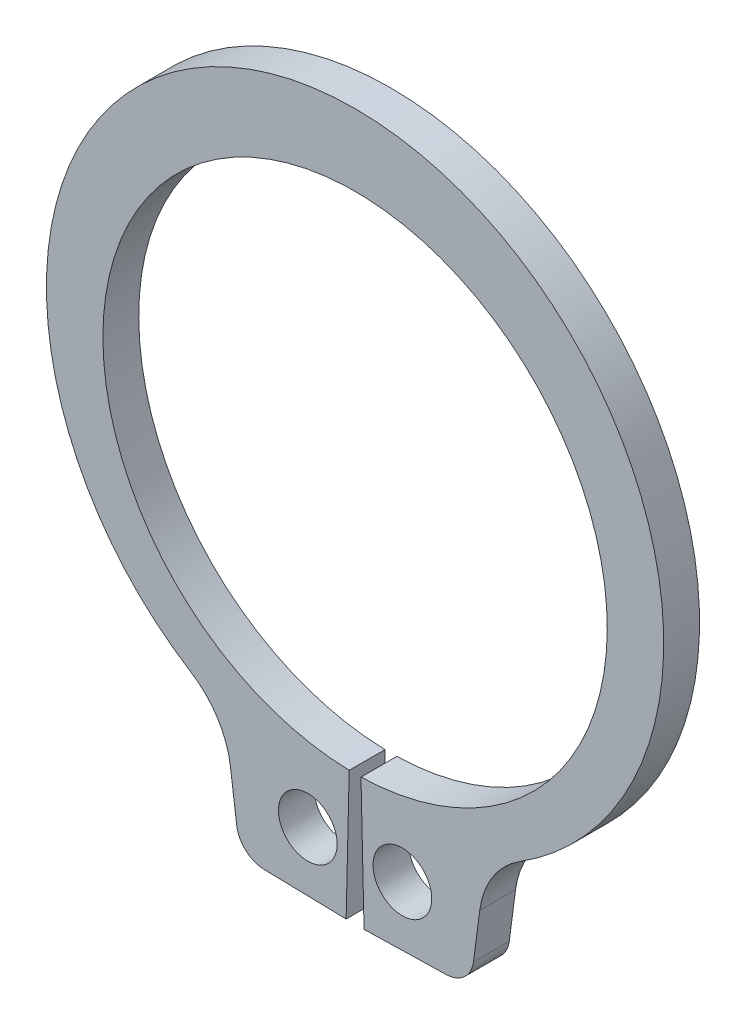
ISO-10303-21;
HEADER;
FILE_DESCRIPTION(('STEP AP214'),'2;1');
FILE_NAME('part.step','',(''),(''),'','','');
FILE_SCHEMA(('AUTOMOTIVE_DESIGN { 1 0 10303 214 1 1 1 1 }'));
ENDSEC;
DATA;
#1=APPLICATION_CONTEXT('core data for automotive mechanical design processes');
#2=APPLICATION_PROTOCOL_DEFINITION('international standard','automotive_design',2000,#1);
#3=PRODUCT_CONTEXT('',#1,'mechanical');
#4=PRODUCT('Part','Part','',(#3));
#5=PRODUCT_RELATED_PRODUCT_CATEGORY('part','',(#4));
#6=PRODUCT_DEFINITION_FORMATION('','',#4);
#7=PRODUCT_DEFINITION_CONTEXT('part definition',#1,'design');
#8=PRODUCT_DEFINITION('design','',#6,#7);
#9=PRODUCT_DEFINITION_SHAPE('','',#8);
#10=(LENGTH_UNIT() NAMED_UNIT(*) SI_UNIT(.MILLI.,.METRE.));
#11=(NAMED_UNIT(*) PLANE_ANGLE_UNIT() SI_UNIT($,.RADIAN.));
#12=(NAMED_UNIT(*) SI_UNIT($,.STERADIAN.) SOLID_ANGLE_UNIT());
#13=UNCERTAINTY_MEASURE_WITH_UNIT(LENGTH_MEASURE(1.E-05),#10,'distance_accuracy_value','');
#14=(GEOMETRIC_REPRESENTATION_CONTEXT(3) GLOBAL_UNCERTAINTY_ASSIGNED_CONTEXT((#13)) GLOBAL_UNIT_ASSIGNED_CONTEXT((#10,
#11,#12)) REPRESENTATION_CONTEXT('',''));
#15=CARTESIAN_POINT('',(0.,0.,0.));
#16=DIRECTION('',(0.,0.,1.));
#17=DIRECTION('',(1.,0.,0.));
#18=AXIS2_PLACEMENT_3D('',#15,#16,#17);
#19=CARTESIAN_POINT('',(0.,0.,-0.635));
#20=DIRECTION('',(0.,0.,1.));
#21=DIRECTION('',(1.,0.,0.));
#22=AXIS2_PLACEMENT_3D('',#19,#20,#21);
#23=CYLINDRICAL_SURFACE('',#22,4.4704);
#24=CARTESIAN_POINT('',(0.,0.,0.));
#25=DIRECTION('',(0.,0.,-1.));
#26=DIRECTION('',(1.,0.,0.));
#27=AXIS2_PLACEMENT_3D('',#24,#25,#26);
#28=CIRCLE('',#27,4.4704);
#29=CARTESIAN_POINT('',(-0.104644194756554,-4.46917506398035,0.));
#30=VERTEX_POINT('',#29);
#31=CARTESIAN_POINT('',(0.104644194756554,-4.46917506398035,0.));
#32=VERTEX_POINT('',#31);
#33=EDGE_CURVE('E162',#30,#32,#28,.T.);
#34=ORIENTED_EDGE('',*,*,#33,.F.);
#35=DIRECTION('',(0.,0.,1.));
#36=VECTOR('',#35,1.);
#37=CARTESIAN_POINT('',(-0.104644194756554,-4.46917506398035,-0.635));
#38=LINE('',#37,#36);
#39=CARTESIAN_POINT('',(-0.104644194756554,-4.46917506398035,-0.635));
#40=VERTEX_POINT('',#39);
#41=EDGE_CURVE('E11',#40,#30,#38,.T.);
#42=ORIENTED_EDGE('',*,*,#41,.F.);
#43=CARTESIAN_POINT('',(0.,0.,-0.635));
#44=DIRECTION('',(0.,0.,-1.));
#45=DIRECTION('',(1.,0.,0.));
#46=AXIS2_PLACEMENT_3D('',#43,#44,#45);
#47=CIRCLE('',#46,4.4704);
#48=CARTESIAN_POINT('',(0.104644194756554,-4.46917506398035,-0.635));
#49=VERTEX_POINT('',#48);
#50=EDGE_CURVE('E195',#40,#49,#47,.T.);
#51=ORIENTED_EDGE('',*,*,#50,.T.);
#52=DIRECTION('',(0.,0.,1.));
#53=VECTOR('',#52,1.);
#54=CARTESIAN_POINT('',(0.104644194756554,-4.46917506398035,-0.635));
#55=LINE('',#54,#53);
#56=EDGE_CURVE('E44',#49,#32,#55,.T.);
#57=ORIENTED_EDGE('',*,*,#56,.T.);
#58=EDGE_LOOP('',(#34,#42,#51,#57));
#59=FACE_BOUND('',#58,.T.);
#60=ADVANCED_FACE('F41',(#59),#23,.F.);
#61=CARTESIAN_POINT('',(-0.104644194756554,-4.46917506398035,-0.635));
#62=DIRECTION('',(0.99972598961622,-0.0234082397003745,0.));
#63=DIRECTION('',(0.0234082397003745,0.99972598961622,0.));
#64=AXIS2_PLACEMENT_3D('',#61,#62,#63);
#65=PLANE('',#64);
#66=DIRECTION('',(0.0234082397003745,0.99972598961622,0.));
#67=VECTOR('',#66,1.);
#68=CARTESIAN_POINT('',(-0.104644194756554,-4.46917506398035,0.));
#69=LINE('',#68,#67);
#70=CARTESIAN_POINT('',(-0.15875,-6.77994171637928,0.));
#71=VERTEX_POINT('',#70);
#72=EDGE_CURVE('E193',#71,#30,#69,.T.);
#73=ORIENTED_EDGE('',*,*,#72,.F.);
#74=DIRECTION('',(0.,0.,1.));
#75=VECTOR('',#74,1.);
#76=CARTESIAN_POINT('',(-0.15875,-6.77994171637928,-0.635));
#77=LINE('',#76,#75);
#78=CARTESIAN_POINT('',(-0.15875,-6.77994171637928,-0.635));
#79=VERTEX_POINT('',#78);
#80=EDGE_CURVE('E50',#79,#71,#77,.T.);
#81=ORIENTED_EDGE('',*,*,#80,.F.);
#82=DIRECTION('',(0.0234082397003745,0.99972598961622,0.));
#83=VECTOR('',#82,1.);
#84=CARTESIAN_POINT('',(-0.104644194756554,-4.46917506398035,-0.635));
#85=LINE('',#84,#83);
#86=EDGE_CURVE('E152',#79,#40,#85,.T.);
#87=ORIENTED_EDGE('',*,*,#86,.T.);
#88=ORIENTED_EDGE('',*,*,#41,.T.);
#89=EDGE_LOOP('',(#73,#81,#87,#88));
#90=FACE_BOUND('',#89,.T.);
#91=ADVANCED_FACE('F215',(#90),#65,.T.);
#92=CARTESIAN_POINT('',(-0.15875,-6.77994171637928,-0.635));
#93=DIRECTION('',(-0.0234082397003748,-0.99972598961622,0.));
#94=DIRECTION('',(0.99972598961622,-0.0234082397003748,0.));
#95=AXIS2_PLACEMENT_3D('',#92,#93,#94);
#96=PLANE('',#95);
#97=DIRECTION('',(0.99972598961622,-0.0234082397003748,0.));
#98=VECTOR('',#97,1.);
#99=CARTESIAN_POINT('',(-0.15875,-6.77994171637928,0.));
#100=LINE('',#99,#98);
#101=CARTESIAN_POINT('',(-1.61409910187213,-6.74586521844065,0.));
#102=VERTEX_POINT('',#101);
#103=EDGE_CURVE('E139',#102,#71,#100,.T.);
#104=ORIENTED_EDGE('',*,*,#103,.F.);
#105=DIRECTION('',(0.,0.,1.));
#106=VECTOR('',#105,1.);
#107=CARTESIAN_POINT('',(-1.61409910187213,-6.74586521844065,-0.635));
#108=LINE('',#107,#106);
#109=CARTESIAN_POINT('',(-1.61409910187213,-6.74586521844065,-0.635));
#110=VERTEX_POINT('',#109);
#111=EDGE_CURVE('E134',#110,#102,#108,.T.);
#112=ORIENTED_EDGE('',*,*,#111,.F.);
#113=DIRECTION('',(0.99972598961622,-0.0234082397003748,0.));
#114=VECTOR('',#113,1.);
#115=CARTESIAN_POINT('',(-0.15875,-6.77994171637928,-0.635));
#116=LINE('',#115,#114);
#117=EDGE_CURVE('E137',#110,#79,#116,.T.);
#118=ORIENTED_EDGE('',*,*,#117,.T.);
#119=ORIENTED_EDGE('',*,*,#80,.T.);
#120=EDGE_LOOP('',(#104,#112,#118,#119));
#121=FACE_BOUND('',#120,.T.);
#122=ADVANCED_FACE('F136',(#121),#96,.T.);
#123=CARTESIAN_POINT('',(-1.60239498202195,-6.24600222363254,-0.635));
#124=DIRECTION('',(0.,0.,1.));
#125=DIRECTION('',(1.,0.,0.));
#126=AXIS2_PLACEMENT_3D('',#123,#124,#125);
#127=CYLINDRICAL_SURFACE('',#126,0.5);
#128=CARTESIAN_POINT('',(-1.60239498202195,-6.24600222363254,0.));
#129=DIRECTION('',(0.,0.,1.));
#130=DIRECTION('',(1.,0.,0.));
#131=AXIS2_PLACEMENT_3D('',#128,#129,#130);
#132=CIRCLE('',#131,0.5);
#133=CARTESIAN_POINT('',(-2.09811741270885,-6.31126531974257,0.));
#134=VERTEX_POINT('',#133);
#135=EDGE_CURVE('E190',#134,#102,#132,.T.);
#136=ORIENTED_EDGE('',*,*,#135,.F.);
#137=DIRECTION('',(0.,0.,1.));
#138=VECTOR('',#137,1.);
#139=CARTESIAN_POINT('',(-2.09811741270885,-6.31126531974257,-0.635));
#140=LINE('',#139,#138);
#141=CARTESIAN_POINT('',(-2.09811741270885,-6.31126531974257,-0.635));
#142=VERTEX_POINT('',#141);
#143=EDGE_CURVE('E144',#142,#134,#140,.T.);
#144=ORIENTED_EDGE('',*,*,#143,.F.);
#145=CARTESIAN_POINT('',(-1.60239498202195,-6.24600222363254,-0.635));
#146=DIRECTION('',(0.,0.,1.));
#147=DIRECTION('',(1.,0.,0.));
#148=AXIS2_PLACEMENT_3D('',#145,#146,#147);
#149=CIRCLE('',#148,0.5);
#150=EDGE_CURVE('E150',#142,#110,#149,.T.);
#151=ORIENTED_EDGE('',*,*,#150,.T.);
#152=ORIENTED_EDGE('',*,*,#111,.T.);
#153=EDGE_LOOP('',(#136,#144,#151,#152));
#154=FACE_BOUND('',#153,.T.);
#155=ADVANCED_FACE('F154',(#154),#127,.T.);
#156=CARTESIAN_POINT('',(-2.21001393120872,-5.46132687914755,-0.635));
#157=DIRECTION('',(-0.991444861373811,-0.130526192220051,0.));
#158=DIRECTION('',(0.130526192220051,-0.991444861373811,0.));
#159=AXIS2_PLACEMENT_3D('',#156,#157,#158);
#160=PLANE('',#159);
#161=DIRECTION('',(0.130526192220051,-0.991444861373811,0.));
#162=VECTOR('',#161,1.);
#163=CARTESIAN_POINT('',(-2.21001393120872,-5.46132687914755,0.));
#164=LINE('',#163,#162);
#165=CARTESIAN_POINT('',(-2.21001393120872,-5.46132687914755,0.));
#166=VERTEX_POINT('',#165);
#167=EDGE_CURVE('E187',#166,#134,#164,.T.);
#168=ORIENTED_EDGE('',*,*,#167,.F.);
#169=DIRECTION('',(0.,0.,1.));
#170=VECTOR('',#169,1.);
#171=CARTESIAN_POINT('',(-2.21001393120872,-5.46132687914755,-0.635));
#172=LINE('',#171,#170);
#173=CARTESIAN_POINT('',(-2.21001393120872,-5.46132687914755,-0.635));
#174=VERTEX_POINT('',#173);
#175=EDGE_CURVE('E199',#174,#166,#172,.T.);
#176=ORIENTED_EDGE('',*,*,#175,.F.);
#177=DIRECTION('',(0.130526192220051,-0.991444861373811,0.));
#178=VECTOR('',#177,1.);
#179=CARTESIAN_POINT('',(-2.21001393120872,-5.46132687914755,-0.635));
#180=LINE('',#179,#178);
#181=EDGE_CURVE('E155',#174,#142,#180,.T.);
#182=ORIENTED_EDGE('',*,*,#181,.T.);
#183=ORIENTED_EDGE('',*,*,#143,.T.);
#184=EDGE_LOOP('',(#168,#176,#182,#183));
#185=FACE_BOUND('',#184,.T.);
#186=ADVANCED_FACE('F228',(#185),#160,.T.);
#187=CARTESIAN_POINT('',(-3.73313206779057,-5.66184918594921,-0.635));
#188=DIRECTION('',(0.,0.,1.));
#189=DIRECTION('',(1.,0.,0.));
#190=AXIS2_PLACEMENT_3D('',#187,#188,#189);
#191=CYLINDRICAL_SURFACE('',#190,1.53626106294132);
#192=CARTESIAN_POINT('',(-3.73313206779057,-5.66184918594921,0.));
#193=DIRECTION('',(0.,0.,-1.));
#194=DIRECTION('',(1.,0.,0.));
#195=AXIS2_PLACEMENT_3D('',#192,#193,#194);
#196=CIRCLE('',#195,1.53626106294132);
#197=CARTESIAN_POINT('',(-2.91475044430294,-4.36171474219066,0.));
#198=VERTEX_POINT('',#197);
#199=EDGE_CURVE('E184',#198,#166,#196,.T.);
#200=ORIENTED_EDGE('',*,*,#199,.F.);
#201=DIRECTION('',(0.,0.,1.));
#202=VECTOR('',#201,1.);
#203=CARTESIAN_POINT('',(-2.91475044430294,-4.36171474219066,-0.635));
#204=LINE('',#203,#202);
#205=CARTESIAN_POINT('',(-2.91475044430294,-4.36171474219066,-0.635));
#206=VERTEX_POINT('',#205);
#207=EDGE_CURVE('E201',#206,#198,#204,.T.);
#208=ORIENTED_EDGE('',*,*,#207,.F.);
#209=CARTESIAN_POINT('',(-3.73313206779057,-5.66184918594921,-0.635));
#210=DIRECTION('',(0.,0.,-1.));
#211=DIRECTION('',(1.,0.,0.));
#212=AXIS2_PLACEMENT_3D('',#209,#210,#211);
#213=CIRCLE('',#212,1.53626106294132);
#214=EDGE_CURVE('E157',#206,#174,#213,.T.);
#215=ORIENTED_EDGE('',*,*,#214,.T.);
#216=ORIENTED_EDGE('',*,*,#175,.T.);
#217=EDGE_LOOP('',(#200,#208,#215,#216));
#218=FACE_BOUND('',#217,.T.);
#219=ADVANCED_FACE('F231',(#218),#191,.F.);
#220=CARTESIAN_POINT('',(0.,0.268847991426328,-0.635));
#221=DIRECTION('',(0.,0.,1.));
#222=DIRECTION('',(1.,0.,0.));
#223=AXIS2_PLACEMENT_3D('',#220,#221,#222);
#224=CYLINDRICAL_SURFACE('',#223,5.47155200857367);
#225=CARTESIAN_POINT('',(0.,0.268847991426328,0.));
#226=DIRECTION('',(0.,0.,1.));
#227=DIRECTION('',(1.,0.,0.));
#228=AXIS2_PLACEMENT_3D('',#225,#226,#227);
#229=CIRCLE('',#228,5.47155200857367);
#230=CARTESIAN_POINT('',(2.91475044430293,-4.36171474219066,0.));
#231=VERTEX_POINT('',#230);
#232=EDGE_CURVE('E181',#231,#198,#229,.T.);
#233=ORIENTED_EDGE('',*,*,#232,.F.);
#234=DIRECTION('',(0.,0.,1.));
#235=VECTOR('',#234,1.);
#236=CARTESIAN_POINT('',(2.91475044430293,-4.36171474219066,-0.635));
#237=LINE('',#236,#235);
#238=CARTESIAN_POINT('',(2.91475044430293,-4.36171474219066,-0.635));
#239=VERTEX_POINT('',#238);
#240=EDGE_CURVE('E203',#239,#231,#237,.T.);
#241=ORIENTED_EDGE('',*,*,#240,.F.);
#242=CARTESIAN_POINT('',(0.,0.268847991426328,-0.635));
#243=DIRECTION('',(0.,0.,1.));
#244=DIRECTION('',(1.,0.,0.));
#245=AXIS2_PLACEMENT_3D('',#242,#243,#244);
#246=CIRCLE('',#245,5.47155200857367);
#247=EDGE_CURVE('E305',#239,#206,#246,.T.);
#248=ORIENTED_EDGE('',*,*,#247,.T.);
#249=ORIENTED_EDGE('',*,*,#207,.T.);
#250=EDGE_LOOP('',(#233,#241,#248,#249));
#251=FACE_BOUND('',#250,.T.);
#252=ADVANCED_FACE('F235',(#251),#224,.T.);
#253=CARTESIAN_POINT('',(3.73313206779057,-5.66184918594921,-0.635));
#254=DIRECTION('',(0.,0.,1.));
#255=DIRECTION('',(1.,0.,0.));
#256=AXIS2_PLACEMENT_3D('',#253,#254,#255);
#257=CYLINDRICAL_SURFACE('',#256,1.53626106294132);
#258=CARTESIAN_POINT('',(3.73313206779057,-5.66184918594921,0.));
#259=DIRECTION('',(0.,0.,-1.));
#260=DIRECTION('',(1.,0.,0.));
#261=AXIS2_PLACEMENT_3D('',#258,#259,#260);
#262=CIRCLE('',#261,1.53626106294132);
#263=CARTESIAN_POINT('',(2.21001393120872,-5.46132687914755,0.));
#264=VERTEX_POINT('',#263);
#265=EDGE_CURVE('E178',#264,#231,#262,.T.);
#266=ORIENTED_EDGE('',*,*,#265,.F.);
#267=DIRECTION('',(0.,0.,1.));
#268=VECTOR('',#267,1.);
#269=CARTESIAN_POINT('',(2.21001393120872,-5.46132687914755,-0.635));
#270=LINE('',#269,#268);
#271=CARTESIAN_POINT('',(2.21001393120872,-5.46132687914755,-0.635));
#272=VERTEX_POINT('',#271);
#273=EDGE_CURVE('E205',#272,#264,#270,.T.);
#274=ORIENTED_EDGE('',*,*,#273,.F.);
#275=CARTESIAN_POINT('',(3.73313206779057,-5.66184918594921,-0.635));
#276=DIRECTION('',(0.,0.,-1.));
#277=DIRECTION('',(1.,0.,0.));
#278=AXIS2_PLACEMENT_3D('',#275,#276,#277);
#279=CIRCLE('',#278,1.53626106294132);
#280=EDGE_CURVE('E302',#272,#239,#279,.T.);
#281=ORIENTED_EDGE('',*,*,#280,.T.);
#282=ORIENTED_EDGE('',*,*,#240,.T.);
#283=EDGE_LOOP('',(#266,#274,#281,#282));
#284=FACE_BOUND('',#283,.T.);
#285=ADVANCED_FACE('F239',(#284),#257,.F.);
#286=CARTESIAN_POINT('',(2.21001393120872,-5.46132687914755,-0.635));
#287=DIRECTION('',(0.991444861373811,-0.130526192220051,0.));
#288=DIRECTION('',(0.130526192220051,0.991444861373811,0.));
#289=AXIS2_PLACEMENT_3D('',#286,#287,#288);
#290=PLANE('',#289);
#291=DIRECTION('',(0.130526192220051,0.991444861373811,0.));
#292=VECTOR('',#291,1.);
#293=CARTESIAN_POINT('',(2.21001393120872,-5.46132687914755,0.));
#294=LINE('',#293,#292);
#295=CARTESIAN_POINT('',(2.09811741270885,-6.31126531974257,0.));
#296=VERTEX_POINT('',#295);
#297=EDGE_CURVE('E175',#296,#264,#294,.T.);
#298=ORIENTED_EDGE('',*,*,#297,.F.);
#299=DIRECTION('',(0.,0.,1.));
#300=VECTOR('',#299,1.);
#301=CARTESIAN_POINT('',(2.09811741270885,-6.31126531974257,-0.635));
#302=LINE('',#301,#300);
#303=CARTESIAN_POINT('',(2.09811741270885,-6.31126531974257,-0.635));
#304=VERTEX_POINT('',#303);
#305=EDGE_CURVE('E207',#304,#296,#302,.T.);
#306=ORIENTED_EDGE('',*,*,#305,.F.);
#307=DIRECTION('',(0.130526192220051,0.991444861373811,0.));
#308=VECTOR('',#307,1.);
#309=CARTESIAN_POINT('',(2.21001393120872,-5.46132687914755,-0.635));
#310=LINE('',#309,#308);
#311=EDGE_CURVE('E299',#304,#272,#310,.T.);
#312=ORIENTED_EDGE('',*,*,#311,.T.);
#313=ORIENTED_EDGE('',*,*,#273,.T.);
#314=EDGE_LOOP('',(#298,#306,#312,#313));
#315=FACE_BOUND('',#314,.T.);
#316=ADVANCED_FACE('F243',(#315),#290,.T.);
#317=CARTESIAN_POINT('',(1.60239498202195,-6.24600222363254,-0.635));
#318=DIRECTION('',(0.,0.,1.));
#319=DIRECTION('',(1.,0.,0.));
#320=AXIS2_PLACEMENT_3D('',#317,#318,#319);
#321=CYLINDRICAL_SURFACE('',#320,0.5);
#322=CARTESIAN_POINT('',(1.60239498202195,-6.24600222363254,0.));
#323=DIRECTION('',(0.,0.,1.));
#324=DIRECTION('',(-1.,0.,0.));
#325=AXIS2_PLACEMENT_3D('',#322,#323,#324);
#326=CIRCLE('',#325,0.5);
#327=CARTESIAN_POINT('',(1.61409910187213,-6.74586521844065,0.));
#328=VERTEX_POINT('',#327);
#329=EDGE_CURVE('E172',#328,#296,#326,.T.);
#330=ORIENTED_EDGE('',*,*,#329,.F.);
#331=DIRECTION('',(0.,0.,1.));
#332=VECTOR('',#331,1.);
#333=CARTESIAN_POINT('',(1.61409910187213,-6.74586521844065,-0.635));
#334=LINE('',#333,#332);
#335=CARTESIAN_POINT('',(1.61409910187213,-6.74586521844065,-0.635));
#336=VERTEX_POINT('',#335);
#337=EDGE_CURVE('E209',#336,#328,#334,.T.);
#338=ORIENTED_EDGE('',*,*,#337,.F.);
#339=CARTESIAN_POINT('',(1.60239498202195,-6.24600222363254,-0.635));
#340=DIRECTION('',(0.,0.,1.));
#341=DIRECTION('',(-1.,0.,0.));
#342=AXIS2_PLACEMENT_3D('',#339,#340,#341);
#343=CIRCLE('',#342,0.5);
#344=EDGE_CURVE('E296',#336,#304,#343,.T.);
#345=ORIENTED_EDGE('',*,*,#344,.T.);
#346=ORIENTED_EDGE('',*,*,#305,.T.);
#347=EDGE_LOOP('',(#330,#338,#345,#346));
#348=FACE_BOUND('',#347,.T.);
#349=ADVANCED_FACE('F247',(#348),#321,.T.);
#350=CARTESIAN_POINT('',(0.15875,-6.77994171637928,-0.635));
#351=DIRECTION('',(0.0234082397003748,-0.99972598961622,0.));
#352=DIRECTION('',(0.99972598961622,0.0234082397003748,0.));
#353=AXIS2_PLACEMENT_3D('',#350,#351,#352);
#354=PLANE('',#353);
#355=DIRECTION('',(0.99972598961622,0.0234082397003748,0.));
#356=VECTOR('',#355,1.);
#357=CARTESIAN_POINT('',(0.15875,-6.77994171637928,0.));
#358=LINE('',#357,#356);
#359=CARTESIAN_POINT('',(0.15875,-6.77994171637928,0.));
#360=VERTEX_POINT('',#359);
#361=EDGE_CURVE('E169',#360,#328,#358,.T.);
#362=ORIENTED_EDGE('',*,*,#361,.F.);
#363=DIRECTION('',(0.,0.,1.));
#364=VECTOR('',#363,1.);
#365=CARTESIAN_POINT('',(0.15875,-6.77994171637928,-0.635));
#366=LINE('',#365,#364);
#367=CARTESIAN_POINT('',(0.15875,-6.77994171637928,-0.635));
#368=VERTEX_POINT('',#367);
#369=EDGE_CURVE('E210',#368,#360,#366,.T.);
#370=ORIENTED_EDGE('',*,*,#369,.F.);
#371=DIRECTION('',(0.99972598961622,0.0234082397003748,0.));
#372=VECTOR('',#371,1.);
#373=CARTESIAN_POINT('',(0.15875,-6.77994171637928,-0.635));
#374=LINE('',#373,#372);
#375=EDGE_CURVE('E293',#368,#336,#374,.T.);
#376=ORIENTED_EDGE('',*,*,#375,.T.);
#377=ORIENTED_EDGE('',*,*,#337,.T.);
#378=EDGE_LOOP('',(#362,#370,#376,#377));
#379=FACE_BOUND('',#378,.T.);
#380=ADVANCED_FACE('F251',(#379),#354,.T.);
#381=CARTESIAN_POINT('',(0.104644194756554,-4.46917506398035,-0.635));
#382=DIRECTION('',(-0.99972598961622,-0.0234082397003745,0.));
#383=DIRECTION('',(0.0234082397003745,-0.99972598961622,0.));
#384=AXIS2_PLACEMENT_3D('',#381,#382,#383);
#385=PLANE('',#384);
#386=DIRECTION('',(0.0234082397003745,-0.99972598961622,0.));
#387=VECTOR('',#386,1.);
#388=CARTESIAN_POINT('',(0.104644194756554,-4.46917506398035,0.));
#389=LINE('',#388,#387);
#390=EDGE_CURVE('E165',#32,#360,#389,.T.);
#391=ORIENTED_EDGE('',*,*,#390,.F.);
#392=ORIENTED_EDGE('',*,*,#56,.F.);
#393=DIRECTION('',(0.0234082397003745,-0.99972598961622,0.));
#394=VECTOR('',#393,1.);
#395=CARTESIAN_POINT('',(0.104644194756554,-4.46917506398035,-0.635));
#396=LINE('',#395,#394);
#397=EDGE_CURVE('E291',#49,#368,#396,.T.);
#398=ORIENTED_EDGE('',*,*,#397,.T.);
#399=ORIENTED_EDGE('',*,*,#369,.T.);
#400=EDGE_LOOP('',(#391,#392,#398,#399));
#401=FACE_BOUND('',#400,.T.);
#402=ADVANCED_FACE('F212',(#401),#385,.T.);
#403=CARTESIAN_POINT('',(0.,0.,-0.635));
#404=DIRECTION('',(0.,0.,1.));
#405=DIRECTION('',(1.,0.,0.));
#406=AXIS2_PLACEMENT_3D('',#403,#404,#405);
#407=PLANE('',#406);
#408=CARTESIAN_POINT('',(-0.8382,-5.71096632650728,-0.635));
#409=DIRECTION('',(0.,0.,1.));
#410=DIRECTION('',(1.,0.,0.));
#411=AXIS2_PLACEMENT_3D('',#408,#409,#410);
#412=CIRCLE('',#411,0.5207);
#413=CARTESIAN_POINT('',(-0.3175,-5.71096632650728,-0.635));
#414=VERTEX_POINT('',#413);
#415=EDGE_CURVE('E278',#414,#414,#412,.T.);
#416=ORIENTED_EDGE('',*,*,#415,.T.);
#417=EDGE_LOOP('',(#416));
#418=FACE_BOUND('',#417,.T.);
#419=CARTESIAN_POINT('',(0.8382,-5.71096632650728,-0.635));
#420=DIRECTION('',(0.,0.,1.));
#421=DIRECTION('',(1.,0.,0.));
#422=AXIS2_PLACEMENT_3D('',#419,#420,#421);
#423=CIRCLE('',#422,0.5207);
#424=CARTESIAN_POINT('',(1.3589,-5.71096632650728,-0.635));
#425=VERTEX_POINT('',#424);
#426=EDGE_CURVE('E166',#425,#425,#423,.T.);
#427=ORIENTED_EDGE('',*,*,#426,.T.);
#428=EDGE_LOOP('',(#427));
#429=FACE_BOUND('',#428,.T.);
#430=ORIENTED_EDGE('',*,*,#50,.F.);
#431=ORIENTED_EDGE('',*,*,#86,.F.);
#432=ORIENTED_EDGE('',*,*,#117,.F.);
#433=ORIENTED_EDGE('',*,*,#150,.F.);
#434=ORIENTED_EDGE('',*,*,#181,.F.);
#435=ORIENTED_EDGE('',*,*,#214,.F.);
#436=ORIENTED_EDGE('',*,*,#247,.F.);
#437=ORIENTED_EDGE('',*,*,#280,.F.);
#438=ORIENTED_EDGE('',*,*,#311,.F.);
#439=ORIENTED_EDGE('',*,*,#344,.F.);
#440=ORIENTED_EDGE('',*,*,#375,.F.);
#441=ORIENTED_EDGE('',*,*,#397,.F.);
#442=EDGE_LOOP('',(#430,#431,#432,#433,#434,#435,#436,#437,#438,#439,#440,#441));
#443=FACE_BOUND('',#442,.T.);
#444=ADVANCED_FACE('F148',(#418,#429,#443),#407,.F.);
#445=CARTESIAN_POINT('',(0.,0.,0.));
#446=DIRECTION('',(0.,0.,1.));
#447=DIRECTION('',(1.,0.,0.));
#448=AXIS2_PLACEMENT_3D('',#445,#446,#447);
#449=PLANE('',#448);
#450=CARTESIAN_POINT('',(-0.8382,-5.71096632650728,0.));
#451=DIRECTION('',(0.,0.,1.));
#452=DIRECTION('',(1.,0.,0.));
#453=AXIS2_PLACEMENT_3D('',#450,#451,#452);
#454=CIRCLE('',#453,0.5207);
#455=CARTESIAN_POINT('',(-0.3175,-5.71096632650728,0.));
#456=VERTEX_POINT('',#455);
#457=EDGE_CURVE('E281',#456,#456,#454,.T.);
#458=ORIENTED_EDGE('',*,*,#457,.F.);
#459=EDGE_LOOP('',(#458));
#460=FACE_BOUND('',#459,.T.);
#461=CARTESIAN_POINT('',(0.8382,-5.71096632650728,0.));
#462=DIRECTION('',(0.,0.,1.));
#463=DIRECTION('',(1.,0.,0.));
#464=AXIS2_PLACEMENT_3D('',#461,#462,#463);
#465=CIRCLE('',#464,0.5207);
#466=CARTESIAN_POINT('',(1.3589,-5.71096632650728,0.));
#467=VERTEX_POINT('',#466);
#468=EDGE_CURVE('E283',#467,#467,#465,.T.);
#469=ORIENTED_EDGE('',*,*,#468,.F.);
#470=EDGE_LOOP('',(#469));
#471=FACE_BOUND('',#470,.T.);
#472=ORIENTED_EDGE('',*,*,#33,.T.);
#473=ORIENTED_EDGE('',*,*,#390,.T.);
#474=ORIENTED_EDGE('',*,*,#361,.T.);
#475=ORIENTED_EDGE('',*,*,#329,.T.);
#476=ORIENTED_EDGE('',*,*,#297,.T.);
#477=ORIENTED_EDGE('',*,*,#265,.T.);
#478=ORIENTED_EDGE('',*,*,#232,.T.);
#479=ORIENTED_EDGE('',*,*,#199,.T.);
#480=ORIENTED_EDGE('',*,*,#167,.T.);
#481=ORIENTED_EDGE('',*,*,#135,.T.);
#482=ORIENTED_EDGE('',*,*,#103,.T.);
#483=ORIENTED_EDGE('',*,*,#72,.T.);
#484=EDGE_LOOP('',(#472,#473,#474,#475,#476,#477,#478,#479,#480,#481,#482,#483));
#485=FACE_BOUND('',#484,.T.);
#486=ADVANCED_FACE('F214',(#460,#471,#485),#449,.T.);
#487=CARTESIAN_POINT('',(0.8382,-5.71096632650728,-0.635));
#488=DIRECTION('',(0.,0.,1.));
#489=DIRECTION('',(1.,0.,0.));
#490=AXIS2_PLACEMENT_3D('',#487,#488,#489);
#491=CYLINDRICAL_SURFACE('',#490,0.5207);
#492=ORIENTED_EDGE('',*,*,#426,.F.);
#493=EDGE_LOOP('',(#492));
#494=FACE_BOUND('',#493,.T.);
#495=ORIENTED_EDGE('',*,*,#468,.T.);
#496=EDGE_LOOP('',(#495));
#497=FACE_BOUND('',#496,.T.);
#498=ADVANCED_FACE('F263',(#494,#497),#491,.F.);
#499=CARTESIAN_POINT('',(-0.8382,-5.71096632650728,-0.635));
#500=DIRECTION('',(0.,0.,1.));
#501=DIRECTION('',(1.,0.,0.));
#502=AXIS2_PLACEMENT_3D('',#499,#500,#501);
#503=CYLINDRICAL_SURFACE('',#502,0.5207);
#504=ORIENTED_EDGE('',*,*,#415,.F.);
#505=EDGE_LOOP('',(#504));
#506=FACE_BOUND('',#505,.T.);
#507=ORIENTED_EDGE('',*,*,#457,.T.);
#508=EDGE_LOOP('',(#507));
#509=FACE_BOUND('',#508,.T.);
#510=ADVANCED_FACE('F270',(#506,#509),#503,.F.);
#511=CLOSED_SHELL('',(#60,#91,#122,#155,#186,#219,#252,#285,#316,#349,#380,#402,#444,#486,#498,#510));
#512=MANIFOLD_SOLID_BREP('B2',#511);
#513=ADVANCED_BREP_SHAPE_REPRESENTATION('',(#18,#512),#14);
#514=SHAPE_DEFINITION_REPRESENTATION(#9,#513);
ENDSEC;
END-ISO-10303-21;
